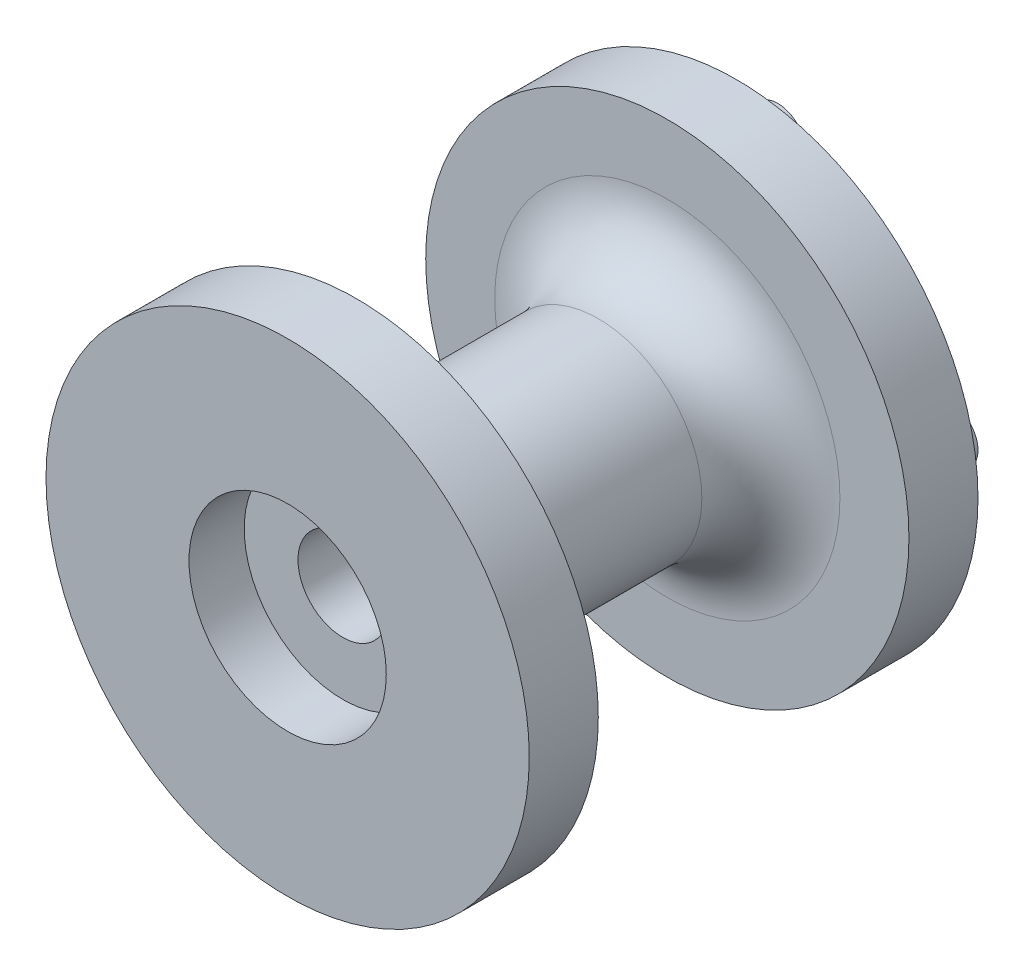
ISO-10303-21;
HEADER;
FILE_DESCRIPTION(('STEP AP214'),'2;1');
FILE_NAME('part.step','',(''),(''),'','','');
FILE_SCHEMA(('AUTOMOTIVE_DESIGN { 1 0 10303 214 1 1 1 1 }'));
ENDSEC;
DATA;
#1=APPLICATION_CONTEXT('core data for automotive mechanical design processes');
#2=APPLICATION_PROTOCOL_DEFINITION('international standard','automotive_design',2000,#1);
#3=PRODUCT_CONTEXT('',#1,'mechanical');
#4=PRODUCT('Part','Part','',(#3));
#5=PRODUCT_RELATED_PRODUCT_CATEGORY('part','',(#4));
#6=PRODUCT_DEFINITION_FORMATION('','',#4);
#7=PRODUCT_DEFINITION_CONTEXT('part definition',#1,'design');
#8=PRODUCT_DEFINITION('design','',#6,#7);
#9=PRODUCT_DEFINITION_SHAPE('','',#8);
#10=(LENGTH_UNIT() NAMED_UNIT(*) SI_UNIT(.MILLI.,.METRE.));
#11=(NAMED_UNIT(*) PLANE_ANGLE_UNIT() SI_UNIT($,.RADIAN.));
#12=(NAMED_UNIT(*) SI_UNIT($,.STERADIAN.) SOLID_ANGLE_UNIT());
#13=UNCERTAINTY_MEASURE_WITH_UNIT(LENGTH_MEASURE(1.E-05),#10,'distance_accuracy_value','');
#14=(GEOMETRIC_REPRESENTATION_CONTEXT(3) GLOBAL_UNCERTAINTY_ASSIGNED_CONTEXT((#13)) GLOBAL_UNIT_ASSIGNED_CONTEXT((#10,
#11,#12)) REPRESENTATION_CONTEXT('',''));
#15=CARTESIAN_POINT('',(0.,0.,0.));
#16=DIRECTION('',(0.,0.,1.));
#17=DIRECTION('',(1.,0.,0.));
#18=AXIS2_PLACEMENT_3D('',#15,#16,#17);
#19=CARTESIAN_POINT('',(0.,0.,-57.));
#20=DIRECTION('',(0.,0.,-1.));
#21=DIRECTION('',(-1.,0.,0.));
#22=AXIS2_PLACEMENT_3D('',#19,#20,#21);
#23=PLANE('',#22);
#24=CARTESIAN_POINT('',(0.,0.,-57.));
#25=DIRECTION('',(0.,0.,-1.));
#26=DIRECTION('',(-1.,0.,0.));
#27=AXIS2_PLACEMENT_3D('',#24,#25,#26);
#28=CIRCLE('',#27,6.5);
#29=CARTESIAN_POINT('',(-6.5,0.,-57.));
#30=VERTEX_POINT('',#29);
#31=EDGE_CURVE('E89',#30,#30,#28,.T.);
#32=ORIENTED_EDGE('',*,*,#31,.F.);
#33=EDGE_LOOP('',(#32));
#34=FACE_BOUND('',#33,.T.);
#35=CARTESIAN_POINT('',(0.,0.,-57.));
#36=DIRECTION('',(0.,0.,1.));
#37=DIRECTION('',(1.,0.,0.));
#38=AXIS2_PLACEMENT_3D('',#35,#36,#37);
#39=CIRCLE('',#38,14.29);
#40=CARTESIAN_POINT('',(14.29,0.,-57.));
#41=VERTEX_POINT('',#40);
#42=EDGE_CURVE('E83',#41,#41,#39,.T.);
#43=ORIENTED_EDGE('',*,*,#42,.F.);
#44=EDGE_LOOP('',(#43));
#45=FACE_BOUND('',#44,.T.);
#46=ADVANCED_FACE('F43',(#34,#45),#23,.T.);
#47=CARTESIAN_POINT('',(0.,0.,-10.));
#48=DIRECTION('',(0.,0.,1.));
#49=DIRECTION('',(1.,0.,0.));
#50=AXIS2_PLACEMENT_3D('',#47,#48,#49);
#51=CYLINDRICAL_SURFACE('',#50,14.29);
#52=CARTESIAN_POINT('',(0.,0.,-65.));
#53=DIRECTION('',(0.,0.,1.));
#54=DIRECTION('',(1.,0.,0.));
#55=AXIS2_PLACEMENT_3D('',#52,#53,#54);
#56=CIRCLE('',#55,14.29);
#57=CARTESIAN_POINT('',(14.29,0.,-65.));
#58=VERTEX_POINT('',#57);
#59=EDGE_CURVE('E93',#58,#58,#56,.T.);
#60=ORIENTED_EDGE('',*,*,#59,.F.);
#61=EDGE_LOOP('',(#60));
#62=FACE_BOUND('',#61,.T.);
#63=ORIENTED_EDGE('',*,*,#42,.T.);
#64=EDGE_LOOP('',(#63));
#65=FACE_BOUND('',#64,.T.);
#66=ADVANCED_FACE('F153',(#62,#65),#51,.F.);
#67=CARTESIAN_POINT('',(0.,0.,-65.));
#68=DIRECTION('',(0.,0.,1.));
#69=DIRECTION('',(1.,0.,0.));
#70=AXIS2_PLACEMENT_3D('',#67,#68,#69);
#71=PLANE('',#70);
#72=CARTESIAN_POINT('',(0.,-25.,-65.));
#73=DIRECTION('',(0.,0.,1.));
#74=DIRECTION('',(1.,0.,0.));
#75=AXIS2_PLACEMENT_3D('',#72,#73,#74);
#76=CIRCLE('',#75,4.);
#77=CARTESIAN_POINT('',(4.,-25.,-65.));
#78=VERTEX_POINT('',#77);
#79=EDGE_CURVE('E56',#78,#78,#76,.F.);
#80=ORIENTED_EDGE('',*,*,#79,.F.);
#81=EDGE_LOOP('',(#80));
#82=FACE_BOUND('',#81,.T.);
#83=CARTESIAN_POINT('',(-25.,0.,-65.));
#84=DIRECTION('',(0.,0.,1.));
#85=DIRECTION('',(1.,0.,0.));
#86=AXIS2_PLACEMENT_3D('',#83,#84,#85);
#87=CIRCLE('',#86,4.);
#88=CARTESIAN_POINT('',(-21.,0.,-65.));
#89=VERTEX_POINT('',#88);
#90=EDGE_CURVE('E61',#89,#89,#87,.F.);
#91=ORIENTED_EDGE('',*,*,#90,.F.);
#92=EDGE_LOOP('',(#91));
#93=FACE_BOUND('',#92,.T.);
#94=CARTESIAN_POINT('',(0.,25.,-65.));
#95=DIRECTION('',(0.,0.,1.));
#96=DIRECTION('',(1.,0.,0.));
#97=AXIS2_PLACEMENT_3D('',#94,#95,#96);
#98=CIRCLE('',#97,4.);
#99=CARTESIAN_POINT('',(4.,25.,-65.));
#100=VERTEX_POINT('',#99);
#101=EDGE_CURVE('E67',#100,#100,#98,.F.);
#102=ORIENTED_EDGE('',*,*,#101,.F.);
#103=EDGE_LOOP('',(#102));
#104=FACE_BOUND('',#103,.T.);
#105=CARTESIAN_POINT('',(25.,0.,-65.));
#106=DIRECTION('',(0.,0.,1.));
#107=DIRECTION('',(1.,0.,0.));
#108=AXIS2_PLACEMENT_3D('',#105,#106,#107);
#109=CIRCLE('',#108,4.);
#110=CARTESIAN_POINT('',(29.,0.,-65.));
#111=VERTEX_POINT('',#110);
#112=EDGE_CURVE('E71',#111,#111,#109,.F.);
#113=ORIENTED_EDGE('',*,*,#112,.F.);
#114=EDGE_LOOP('',(#113));
#115=FACE_BOUND('',#114,.T.);
#116=CARTESIAN_POINT('',(0.,0.,-65.));
#117=DIRECTION('',(0.,0.,1.));
#118=DIRECTION('',(1.,0.,0.));
#119=AXIS2_PLACEMENT_3D('',#116,#117,#118);
#120=CIRCLE('',#119,35.);
#121=CARTESIAN_POINT('',(35.,0.,-65.));
#122=VERTEX_POINT('',#121);
#123=EDGE_CURVE('E97',#122,#122,#120,.T.);
#124=ORIENTED_EDGE('',*,*,#123,.F.);
#125=EDGE_LOOP('',(#124));
#126=FACE_BOUND('',#125,.T.);
#127=ORIENTED_EDGE('',*,*,#59,.T.);
#128=EDGE_LOOP('',(#127));
#129=FACE_BOUND('',#128,.T.);
#130=ADVANCED_FACE('F149',(#82,#93,#104,#115,#126,#129),#71,.F.);
#131=CARTESIAN_POINT('',(0.,0.,-10.));
#132=DIRECTION('',(0.,0.,1.));
#133=DIRECTION('',(1.,0.,0.));
#134=AXIS2_PLACEMENT_3D('',#131,#132,#133);
#135=CYLINDRICAL_SURFACE('',#134,35.);
#136=ORIENTED_EDGE('',*,*,#123,.T.);
#137=EDGE_LOOP('',(#136));
#138=FACE_BOUND('',#137,.T.);
#139=CARTESIAN_POINT('',(0.,0.,-55.));
#140=DIRECTION('',(0.,0.,1.));
#141=DIRECTION('',(1.,0.,0.));
#142=AXIS2_PLACEMENT_3D('',#139,#140,#141);
#143=CIRCLE('',#142,35.);
#144=CARTESIAN_POINT('',(35.,0.,-55.));
#145=VERTEX_POINT('',#144);
#146=EDGE_CURVE('E101',#145,#145,#143,.T.);
#147=ORIENTED_EDGE('',*,*,#146,.F.);
#148=EDGE_LOOP('',(#147));
#149=FACE_BOUND('',#148,.T.);
#150=ADVANCED_FACE('F152',(#138,#149),#135,.T.);
#151=CARTESIAN_POINT('',(0.,0.,-55.));
#152=DIRECTION('',(0.,0.,1.));
#153=DIRECTION('',(1.,0.,0.));
#154=AXIS2_PLACEMENT_3D('',#151,#152,#153);
#155=PLANE('',#154);
#156=CARTESIAN_POINT('',(0.,0.,-55.));
#157=DIRECTION('',(0.,0.,1.));
#158=DIRECTION('',(1.,0.,0.));
#159=AXIS2_PLACEMENT_3D('',#156,#157,#158);
#160=CIRCLE('',#159,25.);
#161=CARTESIAN_POINT('',(25.,0.,-55.));
#162=VERTEX_POINT('',#161);
#163=EDGE_CURVE('E51',#162,#162,#160,.F.);
#164=ORIENTED_EDGE('',*,*,#163,.T.);
#165=EDGE_LOOP('',(#164));
#166=FACE_BOUND('',#165,.T.);
#167=ORIENTED_EDGE('',*,*,#146,.T.);
#168=EDGE_LOOP('',(#167));
#169=FACE_BOUND('',#168,.T.);
#170=ADVANCED_FACE('F227',(#166,#169),#155,.T.);
#171=CARTESIAN_POINT('',(0.,0.,-10.));
#172=DIRECTION('',(0.,0.,1.));
#173=DIRECTION('',(1.,0.,0.));
#174=AXIS2_PLACEMENT_3D('',#171,#172,#173);
#175=CYLINDRICAL_SURFACE('',#174,15.);
#176=CARTESIAN_POINT('',(0.,0.,-45.));
#177=DIRECTION('',(0.,0.,1.));
#178=DIRECTION('',(1.,0.,0.));
#179=AXIS2_PLACEMENT_3D('',#176,#177,#178);
#180=CIRCLE('',#179,15.);
#181=CARTESIAN_POINT('',(15.,0.,-45.));
#182=VERTEX_POINT('',#181);
#183=EDGE_CURVE('E10',#182,#182,#180,.T.);
#184=ORIENTED_EDGE('',*,*,#183,.T.);
#185=EDGE_LOOP('',(#184));
#186=FACE_BOUND('',#185,.T.);
#187=CARTESIAN_POINT('',(0.,0.,-20.));
#188=DIRECTION('',(0.,0.,1.));
#189=DIRECTION('',(1.,0.,0.));
#190=AXIS2_PLACEMENT_3D('',#187,#188,#189);
#191=CIRCLE('',#190,15.);
#192=CARTESIAN_POINT('',(15.,0.,-20.));
#193=VERTEX_POINT('',#192);
#194=EDGE_CURVE('E75',#193,#193,#191,.F.);
#195=ORIENTED_EDGE('',*,*,#194,.T.);
#196=EDGE_LOOP('',(#195));
#197=FACE_BOUND('',#196,.T.);
#198=ADVANCED_FACE('F199',(#186,#197),#175,.T.);
#199=CARTESIAN_POINT('',(0.,0.,-10.));
#200=DIRECTION('',(0.,0.,1.));
#201=DIRECTION('',(1.,0.,0.));
#202=AXIS2_PLACEMENT_3D('',#199,#200,#201);
#203=PLANE('',#202);
#204=CARTESIAN_POINT('',(0.,0.,-10.));
#205=DIRECTION('',(0.,0.,1.));
#206=DIRECTION('',(1.,0.,0.));
#207=AXIS2_PLACEMENT_3D('',#204,#205,#206);
#208=CIRCLE('',#207,25.);
#209=CARTESIAN_POINT('',(25.,0.,-10.));
#210=VERTEX_POINT('',#209);
#211=EDGE_CURVE('E79',#210,#210,#208,.T.);
#212=ORIENTED_EDGE('',*,*,#211,.T.);
#213=EDGE_LOOP('',(#212));
#214=FACE_BOUND('',#213,.T.);
#215=CARTESIAN_POINT('',(0.,0.,-10.));
#216=DIRECTION('',(0.,0.,1.));
#217=DIRECTION('',(1.,0.,0.));
#218=AXIS2_PLACEMENT_3D('',#215,#216,#217);
#219=CIRCLE('',#218,35.);
#220=CARTESIAN_POINT('',(35.,0.,-10.));
#221=VERTEX_POINT('',#220);
#222=EDGE_CURVE('E105',#221,#221,#219,.T.);
#223=ORIENTED_EDGE('',*,*,#222,.F.);
#224=EDGE_LOOP('',(#223));
#225=FACE_BOUND('',#224,.T.);
#226=ADVANCED_FACE('F195',(#214,#225),#203,.F.);
#227=CARTESIAN_POINT('',(0.,0.,-10.));
#228=DIRECTION('',(0.,0.,1.));
#229=DIRECTION('',(1.,0.,0.));
#230=AXIS2_PLACEMENT_3D('',#227,#228,#229);
#231=CYLINDRICAL_SURFACE('',#230,35.);
#232=ORIENTED_EDGE('',*,*,#222,.T.);
#233=EDGE_LOOP('',(#232));
#234=FACE_BOUND('',#233,.T.);
#235=CARTESIAN_POINT('',(0.,0.,0.));
#236=DIRECTION('',(0.,0.,1.));
#237=DIRECTION('',(1.,0.,0.));
#238=AXIS2_PLACEMENT_3D('',#235,#236,#237);
#239=CIRCLE('',#238,35.);
#240=CARTESIAN_POINT('',(35.,0.,0.));
#241=VERTEX_POINT('',#240);
#242=EDGE_CURVE('E109',#241,#241,#239,.T.);
#243=ORIENTED_EDGE('',*,*,#242,.F.);
#244=EDGE_LOOP('',(#243));
#245=FACE_BOUND('',#244,.T.);
#246=ADVANCED_FACE('F198',(#234,#245),#231,.T.);
#247=CARTESIAN_POINT('',(0.,0.,0.));
#248=DIRECTION('',(0.,0.,1.));
#249=DIRECTION('',(1.,0.,0.));
#250=AXIS2_PLACEMENT_3D('',#247,#248,#249);
#251=PLANE('',#250);
#252=ORIENTED_EDGE('',*,*,#242,.T.);
#253=EDGE_LOOP('',(#252));
#254=FACE_BOUND('',#253,.T.);
#255=CARTESIAN_POINT('',(0.,0.,0.));
#256=DIRECTION('',(0.,0.,1.));
#257=DIRECTION('',(1.,0.,0.));
#258=AXIS2_PLACEMENT_3D('',#255,#256,#257);
#259=CIRCLE('',#258,14.29);
#260=CARTESIAN_POINT('',(14.29,0.,0.));
#261=VERTEX_POINT('',#260);
#262=EDGE_CURVE('E113',#261,#261,#259,.T.);
#263=ORIENTED_EDGE('',*,*,#262,.F.);
#264=EDGE_LOOP('',(#263));
#265=FACE_BOUND('',#264,.T.);
#266=ADVANCED_FACE('F205',(#254,#265),#251,.T.);
#267=CARTESIAN_POINT('',(0.,0.,-10.));
#268=DIRECTION('',(0.,0.,1.));
#269=DIRECTION('',(1.,0.,0.));
#270=AXIS2_PLACEMENT_3D('',#267,#268,#269);
#271=CYLINDRICAL_SURFACE('',#270,14.29);
#272=CARTESIAN_POINT('',(0.,0.,-8.));
#273=DIRECTION('',(0.,0.,1.));
#274=DIRECTION('',(1.,0.,0.));
#275=AXIS2_PLACEMENT_3D('',#272,#273,#274);
#276=CIRCLE('',#275,14.29);
#277=CARTESIAN_POINT('',(14.29,0.,-8.));
#278=VERTEX_POINT('',#277);
#279=EDGE_CURVE('E88',#278,#278,#276,.T.);
#280=ORIENTED_EDGE('',*,*,#279,.F.);
#281=EDGE_LOOP('',(#280));
#282=FACE_BOUND('',#281,.T.);
#283=ORIENTED_EDGE('',*,*,#262,.T.);
#284=EDGE_LOOP('',(#283));
#285=FACE_BOUND('',#284,.T.);
#286=ADVANCED_FACE('F211',(#282,#285),#271,.F.);
#287=CARTESIAN_POINT('',(0.,0.,-8.));
#288=DIRECTION('',(0.,0.,-1.));
#289=DIRECTION('',(-1.,0.,0.));
#290=AXIS2_PLACEMENT_3D('',#287,#288,#289);
#291=PLANE('',#290);
#292=CARTESIAN_POINT('',(0.,0.,-8.));
#293=DIRECTION('',(0.,0.,-1.));
#294=DIRECTION('',(-1.,0.,0.));
#295=AXIS2_PLACEMENT_3D('',#292,#293,#294);
#296=CIRCLE('',#295,6.5);
#297=CARTESIAN_POINT('',(-6.5,0.,-8.));
#298=VERTEX_POINT('',#297);
#299=EDGE_CURVE('E84',#298,#298,#296,.T.);
#300=ORIENTED_EDGE('',*,*,#299,.T.);
#301=EDGE_LOOP('',(#300));
#302=FACE_BOUND('',#301,.T.);
#303=ORIENTED_EDGE('',*,*,#279,.T.);
#304=EDGE_LOOP('',(#303));
#305=FACE_BOUND('',#304,.T.);
#306=ADVANCED_FACE('F188',(#302,#305),#291,.F.);
#307=CARTESIAN_POINT('',(0.,0.,0.));
#308=DIRECTION('',(0.,0.,-1.));
#309=DIRECTION('',(-1.,0.,0.));
#310=AXIS2_PLACEMENT_3D('',#307,#308,#309);
#311=CYLINDRICAL_SURFACE('',#310,6.5);
#312=ORIENTED_EDGE('',*,*,#31,.T.);
#313=EDGE_LOOP('',(#312));
#314=FACE_BOUND('',#313,.T.);
#315=ORIENTED_EDGE('',*,*,#299,.F.);
#316=EDGE_LOOP('',(#315));
#317=FACE_BOUND('',#316,.T.);
#318=ADVANCED_FACE('F179',(#314,#317),#311,.F.);
#319=CARTESIAN_POINT('',(0.,0.,-20.));
#320=DIRECTION('',(0.,0.,1.));
#321=DIRECTION('',(1.,0.,0.));
#322=AXIS2_PLACEMENT_3D('',#319,#320,#321);
#323=TOROIDAL_SURFACE('',#322,25.,10.);
#324=ORIENTED_EDGE('',*,*,#194,.F.);
#325=EDGE_LOOP('',(#324));
#326=FACE_BOUND('',#325,.T.);
#327=ORIENTED_EDGE('',*,*,#211,.F.);
#328=EDGE_LOOP('',(#327));
#329=FACE_BOUND('',#328,.T.);
#330=ADVANCED_FACE('F176',(#326,#329),#323,.F.);
#331=CARTESIAN_POINT('',(25.,0.,-71.));
#332=DIRECTION('',(0.,0.,1.));
#333=DIRECTION('',(1.,0.,0.));
#334=AXIS2_PLACEMENT_3D('',#331,#332,#333);
#335=CYLINDRICAL_SURFACE('',#334,4.);
#336=CARTESIAN_POINT('',(25.,0.,-71.));
#337=DIRECTION('',(0.,0.,-1.));
#338=DIRECTION('',(-1.,0.,0.));
#339=AXIS2_PLACEMENT_3D('',#336,#337,#338);
#340=CIRCLE('',#339,4.);
#341=CARTESIAN_POINT('',(21.,0.,-71.));
#342=VERTEX_POINT('',#341);
#343=EDGE_CURVE('E123',#342,#342,#340,.T.);
#344=ORIENTED_EDGE('',*,*,#343,.F.);
#345=EDGE_LOOP('',(#344));
#346=FACE_BOUND('',#345,.T.);
#347=ORIENTED_EDGE('',*,*,#112,.T.);
#348=EDGE_LOOP('',(#347));
#349=FACE_BOUND('',#348,.T.);
#350=ADVANCED_FACE('F178',(#346,#349),#335,.T.);
#351=CARTESIAN_POINT('',(0.,0.,-71.));
#352=DIRECTION('',(0.,0.,-1.));
#353=DIRECTION('',(-1.,0.,0.));
#354=AXIS2_PLACEMENT_3D('',#351,#352,#353);
#355=PLANE('',#354);
#356=ORIENTED_EDGE('',*,*,#343,.T.);
#357=EDGE_LOOP('',(#356));
#358=FACE_BOUND('',#357,.T.);
#359=ADVANCED_FACE('F185',(#358),#355,.T.);
#360=CARTESIAN_POINT('',(0.,25.,-71.));
#361=DIRECTION('',(0.,0.,1.));
#362=DIRECTION('',(1.,0.,0.));
#363=AXIS2_PLACEMENT_3D('',#360,#361,#362);
#364=CYLINDRICAL_SURFACE('',#363,4.);
#365=CARTESIAN_POINT('',(0.,25.,-71.));
#366=DIRECTION('',(0.,0.,-1.));
#367=DIRECTION('',(-1.,0.,0.));
#368=AXIS2_PLACEMENT_3D('',#365,#366,#367);
#369=CIRCLE('',#368,4.);
#370=CARTESIAN_POINT('',(-4.,25.,-71.));
#371=VERTEX_POINT('',#370);
#372=EDGE_CURVE('E127',#371,#371,#369,.T.);
#373=ORIENTED_EDGE('',*,*,#372,.F.);
#374=EDGE_LOOP('',(#373));
#375=FACE_BOUND('',#374,.T.);
#376=ORIENTED_EDGE('',*,*,#101,.T.);
#377=EDGE_LOOP('',(#376));
#378=FACE_BOUND('',#377,.T.);
#379=ADVANCED_FACE('F313',(#375,#378),#364,.T.);
#380=CARTESIAN_POINT('',(0.,0.,-71.));
#381=DIRECTION('',(0.,0.,-1.));
#382=DIRECTION('',(-1.,0.,0.));
#383=AXIS2_PLACEMENT_3D('',#380,#381,#382);
#384=PLANE('',#383);
#385=ORIENTED_EDGE('',*,*,#372,.T.);
#386=EDGE_LOOP('',(#385));
#387=FACE_BOUND('',#386,.T.);
#388=ADVANCED_FACE('F327',(#387),#384,.T.);
#389=CARTESIAN_POINT('',(-25.,0.,-71.));
#390=DIRECTION('',(0.,0.,1.));
#391=DIRECTION('',(1.,0.,0.));
#392=AXIS2_PLACEMENT_3D('',#389,#390,#391);
#393=CYLINDRICAL_SURFACE('',#392,4.);
#394=CARTESIAN_POINT('',(-25.,0.,-71.));
#395=DIRECTION('',(0.,0.,-1.));
#396=DIRECTION('',(-1.,0.,0.));
#397=AXIS2_PLACEMENT_3D('',#394,#395,#396);
#398=CIRCLE('',#397,4.);
#399=CARTESIAN_POINT('',(-29.,0.,-71.));
#400=VERTEX_POINT('',#399);
#401=EDGE_CURVE('E131',#400,#400,#398,.T.);
#402=ORIENTED_EDGE('',*,*,#401,.F.);
#403=EDGE_LOOP('',(#402));
#404=FACE_BOUND('',#403,.T.);
#405=ORIENTED_EDGE('',*,*,#90,.T.);
#406=EDGE_LOOP('',(#405));
#407=FACE_BOUND('',#406,.T.);
#408=ADVANCED_FACE('F338',(#404,#407),#393,.T.);
#409=CARTESIAN_POINT('',(-25.,0.,-71.));
#410=DIRECTION('',(0.,0.,-1.));
#411=DIRECTION('',(-1.,0.,0.));
#412=AXIS2_PLACEMENT_3D('',#409,#410,#411);
#413=PLANE('',#412);
#414=ORIENTED_EDGE('',*,*,#401,.T.);
#415=EDGE_LOOP('',(#414));
#416=FACE_BOUND('',#415,.T.);
#417=ADVANCED_FACE('F145',(#416),#413,.T.);
#418=CARTESIAN_POINT('',(0.,-25.,-71.));
#419=DIRECTION('',(0.,0.,1.));
#420=DIRECTION('',(1.,0.,0.));
#421=AXIS2_PLACEMENT_3D('',#418,#419,#420);
#422=CYLINDRICAL_SURFACE('',#421,4.);
#423=CARTESIAN_POINT('',(0.,-25.,-71.));
#424=DIRECTION('',(0.,0.,-1.));
#425=DIRECTION('',(-1.,0.,0.));
#426=AXIS2_PLACEMENT_3D('',#423,#424,#425);
#427=CIRCLE('',#426,4.);
#428=CARTESIAN_POINT('',(-4.,-25.,-71.));
#429=VERTEX_POINT('',#428);
#430=EDGE_CURVE('E135',#429,#429,#427,.T.);
#431=ORIENTED_EDGE('',*,*,#430,.F.);
#432=EDGE_LOOP('',(#431));
#433=FACE_BOUND('',#432,.T.);
#434=ORIENTED_EDGE('',*,*,#79,.T.);
#435=EDGE_LOOP('',(#434));
#436=FACE_BOUND('',#435,.T.);
#437=ADVANCED_FACE('F142',(#433,#436),#422,.T.);
#438=CARTESIAN_POINT('',(0.,-25.,-71.));
#439=DIRECTION('',(0.,0.,-1.));
#440=DIRECTION('',(-1.,0.,0.));
#441=AXIS2_PLACEMENT_3D('',#438,#439,#440);
#442=PLANE('',#441);
#443=ORIENTED_EDGE('',*,*,#430,.T.);
#444=EDGE_LOOP('',(#443));
#445=FACE_BOUND('',#444,.T.);
#446=ADVANCED_FACE('F140',(#445),#442,.T.);
#447=CARTESIAN_POINT('',(0.,0.,-45.));
#448=DIRECTION('',(0.,0.,1.));
#449=DIRECTION('',(1.,0.,0.));
#450=AXIS2_PLACEMENT_3D('',#447,#448,#449);
#451=TOROIDAL_SURFACE('',#450,25.,10.);
#452=ORIENTED_EDGE('',*,*,#183,.F.);
#453=EDGE_LOOP('',(#452));
#454=FACE_BOUND('',#453,.T.);
#455=ORIENTED_EDGE('',*,*,#163,.F.);
#456=EDGE_LOOP('',(#455));
#457=FACE_BOUND('',#456,.T.);
#458=ADVANCED_FACE('F45',(#454,#457),#451,.F.);
#459=CLOSED_SHELL('',(#46,#66,#130,#150,#170,#198,#226,#246,#266,#286,#306,#318,#330,#350,#359,
#379,#388,#408,#417,#437,#446,#458));
#460=MANIFOLD_SOLID_BREP('B2',#459);
#461=ADVANCED_BREP_SHAPE_REPRESENTATION('',(#18,#460),#14);
#462=SHAPE_DEFINITION_REPRESENTATION(#9,#461);
ENDSEC;
END-ISO-10303-21;
